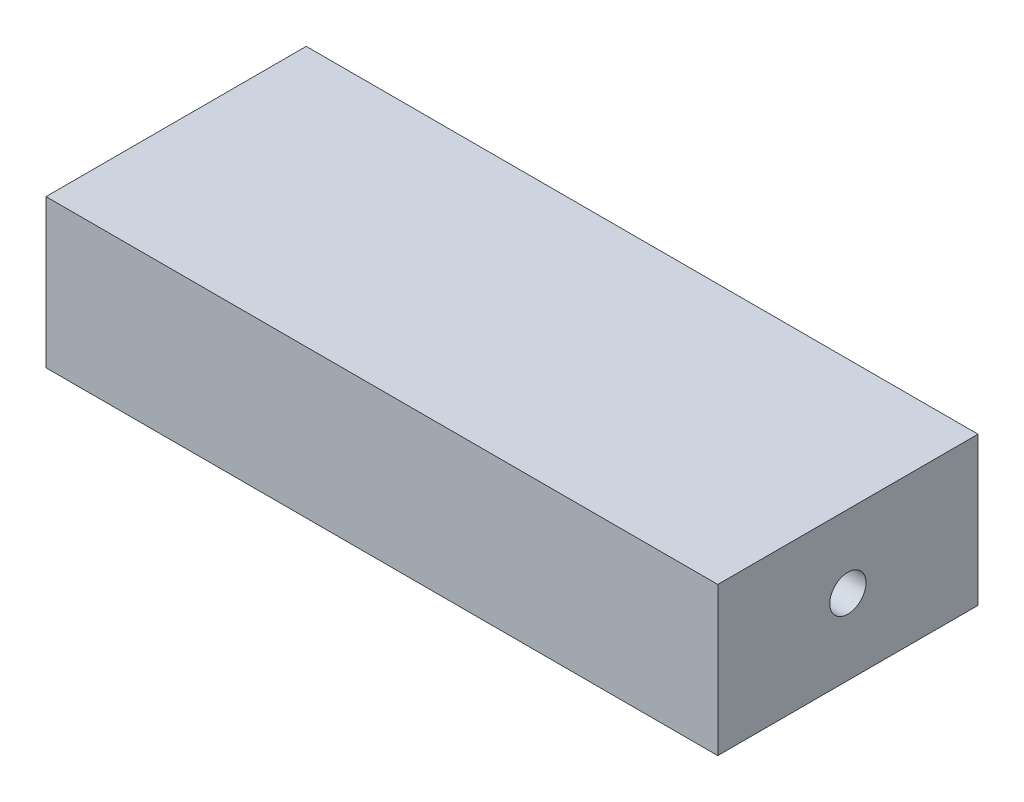
ISO-10303-21;
HEADER;
FILE_DESCRIPTION(('STEP AP214'),'2;1');
FILE_NAME('part.step','',(''),(''),'','','');
FILE_SCHEMA(('AUTOMOTIVE_DESIGN { 1 0 10303 214 1 1 1 1 }'));
ENDSEC;
DATA;
#1=APPLICATION_CONTEXT('core data for automotive mechanical design processes');
#2=APPLICATION_PROTOCOL_DEFINITION('international standard','automotive_design',2000,#1);
#3=PRODUCT_CONTEXT('',#1,'mechanical');
#4=PRODUCT('Part','Part','',(#3));
#5=PRODUCT_RELATED_PRODUCT_CATEGORY('part','',(#4));
#6=PRODUCT_DEFINITION_FORMATION('','',#4);
#7=PRODUCT_DEFINITION_CONTEXT('part definition',#1,'design');
#8=PRODUCT_DEFINITION('design','',#6,#7);
#9=PRODUCT_DEFINITION_SHAPE('','',#8);
#10=(LENGTH_UNIT() NAMED_UNIT(*) SI_UNIT(.MILLI.,.METRE.));
#11=(NAMED_UNIT(*) PLANE_ANGLE_UNIT() SI_UNIT($,.RADIAN.));
#12=(NAMED_UNIT(*) SI_UNIT($,.STERADIAN.) SOLID_ANGLE_UNIT());
#13=UNCERTAINTY_MEASURE_WITH_UNIT(LENGTH_MEASURE(1.E-05),#10,'distance_accuracy_value','');
#14=(GEOMETRIC_REPRESENTATION_CONTEXT(3) GLOBAL_UNCERTAINTY_ASSIGNED_CONTEXT((#13)) GLOBAL_UNIT_ASSIGNED_CONTEXT((#10,
#11,#12)) REPRESENTATION_CONTEXT('',''));
#15=CARTESIAN_POINT('',(0.,0.,0.));
#16=DIRECTION('',(0.,0.,1.));
#17=DIRECTION('',(1.,0.,0.));
#18=AXIS2_PLACEMENT_3D('',#15,#16,#17);
#19=CARTESIAN_POINT('',(111.,22.,-43.));
#20=DIRECTION('',(-1.,0.,0.));
#21=DIRECTION('',(0.,0.,1.));
#22=AXIS2_PLACEMENT_3D('',#19,#20,#21);
#23=PLANE('',#22);
#24=CARTESIAN_POINT('',(111.,11.,0.));
#25=DIRECTION('',(1.,0.,0.));
#26=DIRECTION('',(0.,0.,-1.));
#27=AXIS2_PLACEMENT_3D('',#24,#25,#26);
#28=CIRCLE('',#27,6.);
#29=CARTESIAN_POINT('',(111.,11.,-6.));
#30=VERTEX_POINT('',#29);
#31=EDGE_CURVE('E103',#30,#30,#28,.T.);
#32=ORIENTED_EDGE('',*,*,#31,.F.);
#33=EDGE_LOOP('',(#32));
#34=FACE_BOUND('',#33,.T.);
#35=DIRECTION('',(0.,-1.,0.));
#36=VECTOR('',#35,1.);
#37=CARTESIAN_POINT('',(111.,22.,43.));
#38=LINE('',#37,#36);
#39=CARTESIAN_POINT('',(111.,35.,43.));
#40=VERTEX_POINT('',#39);
#41=CARTESIAN_POINT('',(111.,-14.,43.));
#42=VERTEX_POINT('',#41);
#43=EDGE_CURVE('E55',#40,#42,#38,.T.);
#44=ORIENTED_EDGE('',*,*,#43,.T.);
#45=DIRECTION('',(0.,0.,1.));
#46=VECTOR('',#45,1.);
#47=CARTESIAN_POINT('',(111.,-14.,43.));
#48=LINE('',#47,#46);
#49=CARTESIAN_POINT('',(111.,-14.,-43.));
#50=VERTEX_POINT('',#49);
#51=EDGE_CURVE('E99',#50,#42,#48,.T.);
#52=ORIENTED_EDGE('',*,*,#51,.F.);
#53=DIRECTION('',(0.,-1.,0.));
#54=VECTOR('',#53,1.);
#55=CARTESIAN_POINT('',(111.,22.,-43.));
#56=LINE('',#55,#54);
#57=CARTESIAN_POINT('',(111.,35.,-43.));
#58=VERTEX_POINT('',#57);
#59=EDGE_CURVE('E11',#58,#50,#56,.T.);
#60=ORIENTED_EDGE('',*,*,#59,.F.);
#61=DIRECTION('',(0.,0.,-1.));
#62=VECTOR('',#61,1.);
#63=CARTESIAN_POINT('',(111.,35.,-43.));
#64=LINE('',#63,#62);
#65=EDGE_CURVE('E85',#40,#58,#64,.T.);
#66=ORIENTED_EDGE('',*,*,#65,.F.);
#67=EDGE_LOOP('',(#44,#52,#60,#66));
#68=FACE_BOUND('',#67,.T.);
#69=ADVANCED_FACE('F33',(#34,#68),#23,.F.);
#70=CARTESIAN_POINT('',(-111.,22.,-43.));
#71=DIRECTION('',(0.,0.,1.));
#72=DIRECTION('',(1.,0.,0.));
#73=AXIS2_PLACEMENT_3D('',#70,#71,#72);
#74=PLANE('',#73);
#75=ORIENTED_EDGE('',*,*,#59,.T.);
#76=DIRECTION('',(1.,0.,0.));
#77=VECTOR('',#76,1.);
#78=CARTESIAN_POINT('',(-111.,-14.,-43.));
#79=LINE('',#78,#77);
#80=CARTESIAN_POINT('',(-111.,-14.,-43.));
#81=VERTEX_POINT('',#80);
#82=EDGE_CURVE('E96',#81,#50,#79,.T.);
#83=ORIENTED_EDGE('',*,*,#82,.F.);
#84=DIRECTION('',(0.,-1.,0.));
#85=VECTOR('',#84,1.);
#86=CARTESIAN_POINT('',(-111.,22.,-43.));
#87=LINE('',#86,#85);
#88=CARTESIAN_POINT('',(-111.,35.,-43.));
#89=VERTEX_POINT('',#88);
#90=EDGE_CURVE('E40',#89,#81,#87,.T.);
#91=ORIENTED_EDGE('',*,*,#90,.F.);
#92=DIRECTION('',(-1.,0.,0.));
#93=VECTOR('',#92,1.);
#94=CARTESIAN_POINT('',(-111.,35.,-43.));
#95=LINE('',#94,#93);
#96=EDGE_CURVE('E90',#58,#89,#95,.T.);
#97=ORIENTED_EDGE('',*,*,#96,.F.);
#98=EDGE_LOOP('',(#75,#83,#91,#97));
#99=FACE_BOUND('',#98,.T.);
#100=ADVANCED_FACE('F111',(#99),#74,.F.);
#101=CARTESIAN_POINT('',(-111.,22.,-43.));
#102=DIRECTION('',(1.,0.,0.));
#103=DIRECTION('',(0.,0.,-1.));
#104=AXIS2_PLACEMENT_3D('',#101,#102,#103);
#105=PLANE('',#104);
#106=ORIENTED_EDGE('',*,*,#90,.T.);
#107=DIRECTION('',(0.,0.,-1.));
#108=VECTOR('',#107,1.);
#109=CARTESIAN_POINT('',(-111.,-14.,43.));
#110=LINE('',#109,#108);
#111=CARTESIAN_POINT('',(-111.,-14.,43.));
#112=VERTEX_POINT('',#111);
#113=EDGE_CURVE('E78',#112,#81,#110,.T.);
#114=ORIENTED_EDGE('',*,*,#113,.F.);
#115=DIRECTION('',(0.,-1.,0.));
#116=VECTOR('',#115,1.);
#117=CARTESIAN_POINT('',(-111.,22.,43.));
#118=LINE('',#117,#116);
#119=CARTESIAN_POINT('',(-111.,35.,43.));
#120=VERTEX_POINT('',#119);
#121=EDGE_CURVE('E47',#120,#112,#118,.T.);
#122=ORIENTED_EDGE('',*,*,#121,.F.);
#123=DIRECTION('',(0.,0.,1.));
#124=VECTOR('',#123,1.);
#125=CARTESIAN_POINT('',(-111.,35.,-43.));
#126=LINE('',#125,#124);
#127=EDGE_CURVE('E76',#89,#120,#126,.T.);
#128=ORIENTED_EDGE('',*,*,#127,.F.);
#129=EDGE_LOOP('',(#106,#114,#122,#128));
#130=FACE_BOUND('',#129,.T.);
#131=ADVANCED_FACE('F74',(#130),#105,.F.);
#132=CARTESIAN_POINT('',(-111.,22.,43.));
#133=DIRECTION('',(0.,0.,-1.));
#134=DIRECTION('',(-1.,0.,0.));
#135=AXIS2_PLACEMENT_3D('',#132,#133,#134);
#136=PLANE('',#135);
#137=ORIENTED_EDGE('',*,*,#121,.T.);
#138=DIRECTION('',(-1.,0.,0.));
#139=VECTOR('',#138,1.);
#140=CARTESIAN_POINT('',(-111.,-14.,43.));
#141=LINE('',#140,#139);
#142=EDGE_CURVE('E101',#42,#112,#141,.T.);
#143=ORIENTED_EDGE('',*,*,#142,.F.);
#144=ORIENTED_EDGE('',*,*,#43,.F.);
#145=DIRECTION('',(1.,0.,0.));
#146=VECTOR('',#145,1.);
#147=CARTESIAN_POINT('',(-111.,35.,43.));
#148=LINE('',#147,#146);
#149=EDGE_CURVE('E81',#120,#40,#148,.T.);
#150=ORIENTED_EDGE('',*,*,#149,.F.);
#151=EDGE_LOOP('',(#137,#143,#144,#150));
#152=FACE_BOUND('',#151,.T.);
#153=ADVANCED_FACE('F82',(#152),#136,.F.);
#154=CARTESIAN_POINT('',(81.,11.,0.));
#155=DIRECTION('',(1.,0.,0.));
#156=DIRECTION('',(0.,0.,-1.));
#157=AXIS2_PLACEMENT_3D('',#154,#155,#156);
#158=CYLINDRICAL_SURFACE('',#157,6.);
#159=CARTESIAN_POINT('',(81.,11.,0.));
#160=DIRECTION('',(1.,0.,0.));
#161=DIRECTION('',(0.,0.,-1.));
#162=AXIS2_PLACEMENT_3D('',#159,#160,#161);
#163=CIRCLE('',#162,6.);
#164=CARTESIAN_POINT('',(81.,11.,-6.));
#165=VERTEX_POINT('',#164);
#166=EDGE_CURVE('E104',#165,#165,#163,.T.);
#167=ORIENTED_EDGE('',*,*,#166,.F.);
#168=EDGE_LOOP('',(#167));
#169=FACE_BOUND('',#168,.T.);
#170=ORIENTED_EDGE('',*,*,#31,.T.);
#171=EDGE_LOOP('',(#170));
#172=FACE_BOUND('',#171,.T.);
#173=ADVANCED_FACE('F122',(#169,#172),#158,.F.);
#174=CARTESIAN_POINT('',(81.,11.,0.));
#175=DIRECTION('',(1.,0.,0.));
#176=DIRECTION('',(0.,0.,-1.));
#177=AXIS2_PLACEMENT_3D('',#174,#175,#176);
#178=PLANE('',#177);
#179=ORIENTED_EDGE('',*,*,#166,.T.);
#180=EDGE_LOOP('',(#179));
#181=FACE_BOUND('',#180,.T.);
#182=ADVANCED_FACE('F124',(#181),#178,.T.);
#183=CARTESIAN_POINT('',(0.,-14.,0.));
#184=DIRECTION('',(0.,-1.,0.));
#185=DIRECTION('',(0.,0.,-1.));
#186=AXIS2_PLACEMENT_3D('',#183,#184,#185);
#187=PLANE('',#186);
#188=ORIENTED_EDGE('',*,*,#113,.T.);
#189=ORIENTED_EDGE('',*,*,#82,.T.);
#190=ORIENTED_EDGE('',*,*,#51,.T.);
#191=ORIENTED_EDGE('',*,*,#142,.T.);
#192=EDGE_LOOP('',(#188,#189,#190,#191));
#193=FACE_BOUND('',#192,.T.);
#194=ADVANCED_FACE('F113',(#193),#187,.T.);
#195=CARTESIAN_POINT('',(0.,35.,0.));
#196=DIRECTION('',(0.,1.,0.));
#197=DIRECTION('',(0.,0.,1.));
#198=AXIS2_PLACEMENT_3D('',#195,#196,#197);
#199=PLANE('',#198);
#200=ORIENTED_EDGE('',*,*,#127,.T.);
#201=ORIENTED_EDGE('',*,*,#149,.T.);
#202=ORIENTED_EDGE('',*,*,#65,.T.);
#203=ORIENTED_EDGE('',*,*,#96,.T.);
#204=EDGE_LOOP('',(#200,#201,#202,#203));
#205=FACE_BOUND('',#204,.T.);
#206=ADVANCED_FACE('F88',(#205),#199,.T.);
#207=CLOSED_SHELL('',(#69,#100,#131,#153,#173,#182,#194,#206));
#208=MANIFOLD_SOLID_BREP('B2',#207);
#209=ADVANCED_BREP_SHAPE_REPRESENTATION('',(#18,#208),#14);
#210=SHAPE_DEFINITION_REPRESENTATION(#9,#209);
ENDSEC;
END-ISO-10303-21;
